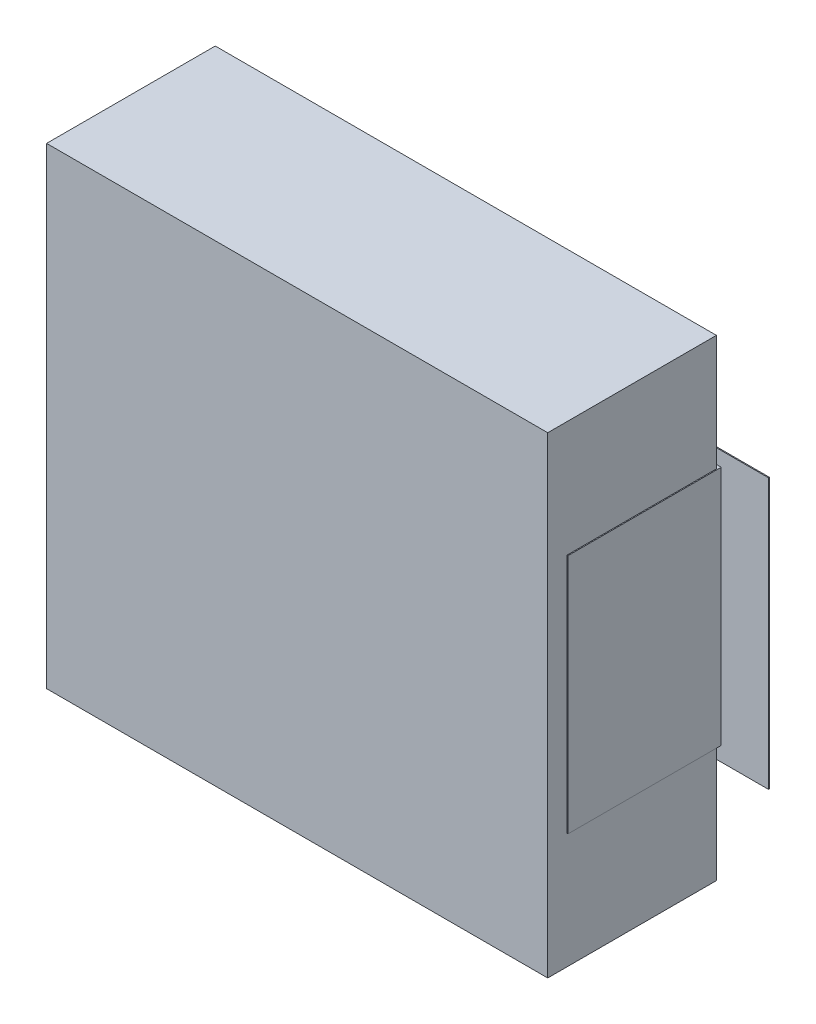
ISO-10303-21;
HEADER;
FILE_DESCRIPTION(('STEP AP214'),'2;1');
FILE_NAME('part.step','',(''),(''),'','','');
FILE_SCHEMA(('AUTOMOTIVE_DESIGN { 1 0 10303 214 1 1 1 1 }'));
ENDSEC;
DATA;
#1=APPLICATION_CONTEXT('core data for automotive mechanical design processes');
#2=APPLICATION_PROTOCOL_DEFINITION('international standard','automotive_design',2000,#1);
#3=PRODUCT_CONTEXT('',#1,'mechanical');
#4=PRODUCT('Part','Part','',(#3));
#5=PRODUCT_RELATED_PRODUCT_CATEGORY('part','',(#4));
#6=PRODUCT_DEFINITION_FORMATION('','',#4);
#7=PRODUCT_DEFINITION_CONTEXT('part definition',#1,'design');
#8=PRODUCT_DEFINITION('design','',#6,#7);
#9=PRODUCT_DEFINITION_SHAPE('','',#8);
#10=(LENGTH_UNIT() NAMED_UNIT(*) SI_UNIT(.MILLI.,.METRE.));
#11=(NAMED_UNIT(*) PLANE_ANGLE_UNIT() SI_UNIT($,.RADIAN.));
#12=(NAMED_UNIT(*) SI_UNIT($,.STERADIAN.) SOLID_ANGLE_UNIT());
#13=UNCERTAINTY_MEASURE_WITH_UNIT(LENGTH_MEASURE(1.E-05),#10,'distance_accuracy_value','');
#14=(GEOMETRIC_REPRESENTATION_CONTEXT(3) GLOBAL_UNCERTAINTY_ASSIGNED_CONTEXT((#13)) GLOBAL_UNIT_ASSIGNED_CONTEXT((#10,
#11,#12)) REPRESENTATION_CONTEXT('',''));
#15=CARTESIAN_POINT('',(0.,0.,0.));
#16=DIRECTION('',(0.,0.,1.));
#17=DIRECTION('',(1.,0.,0.));
#18=AXIS2_PLACEMENT_3D('',#15,#16,#17);
#19=CARTESIAN_POINT('',(0.,0.,0.0762));
#20=DIRECTION('',(0.,0.,1.));
#21=DIRECTION('',(1.,0.,0.));
#22=AXIS2_PLACEMENT_3D('',#19,#20,#21);
#23=PLANE('',#22);
#24=DIRECTION('',(0.,1.,0.));
#25=VECTOR('',#24,1.);
#26=CARTESIAN_POINT('',(1.09999999999992,1.39999999999999,0.0762));
#27=LINE('',#26,#25);
#28=CARTESIAN_POINT('',(1.09999999999992,1.39999999999999,0.0762));
#29=VERTEX_POINT('',#28);
#30=CARTESIAN_POINT('',(1.09999999999992,-1.39999999999999,0.0762));
#31=VERTEX_POINT('',#30);
#32=EDGE_CURVE('E176',#29,#31,#27,.F.);
#33=ORIENTED_EDGE('',*,*,#32,.F.);
#34=DIRECTION('',(1.,0.,0.));
#35=VECTOR('',#34,1.);
#36=CARTESIAN_POINT('',(3.1000000000003,1.39999999999999,0.0762));
#37=LINE('',#36,#35);
#38=CARTESIAN_POINT('',(3.1000000000003,1.39999999999999,0.0762));
#39=VERTEX_POINT('',#38);
#40=EDGE_CURVE('E20',#39,#29,#37,.F.);
#41=ORIENTED_EDGE('',*,*,#40,.F.);
#42=DIRECTION('',(0.,1.,0.));
#43=VECTOR('',#42,1.);
#44=CARTESIAN_POINT('',(3.1000000000003,-1.39999999999999,0.0762));
#45=LINE('',#44,#43);
#46=CARTESIAN_POINT('',(3.1000000000003,-1.39999999999999,0.0762));
#47=VERTEX_POINT('',#46);
#48=EDGE_CURVE('E204',#47,#39,#45,.T.);
#49=ORIENTED_EDGE('',*,*,#48,.F.);
#50=DIRECTION('',(1.,0.,0.));
#51=VECTOR('',#50,1.);
#52=CARTESIAN_POINT('',(1.09999999999992,-1.39999999999999,0.0762));
#53=LINE('',#52,#51);
#54=EDGE_CURVE('E189',#31,#47,#53,.T.);
#55=ORIENTED_EDGE('',*,*,#54,.F.);
#56=EDGE_LOOP('',(#33,#41,#49,#55));
#57=FACE_BOUND('',#56,.T.);
#58=ADVANCED_FACE('F17',(#57),#23,.F.);
#59=CARTESIAN_POINT('',(0.,0.,0.0762));
#60=DIRECTION('',(0.,0.,1.));
#61=DIRECTION('',(1.,0.,0.));
#62=AXIS2_PLACEMENT_3D('',#59,#60,#61);
#63=PLANE('',#62);
#64=DIRECTION('',(0.,1.,0.));
#65=VECTOR('',#64,1.);
#66=CARTESIAN_POINT('',(-1.09999999999992,-1.39999999999999,0.0762));
#67=LINE('',#66,#65);
#68=CARTESIAN_POINT('',(-1.09999999999992,-1.39999999999999,0.0762));
#69=VERTEX_POINT('',#68);
#70=CARTESIAN_POINT('',(-1.09999999999992,1.39999999999999,0.0762));
#71=VERTEX_POINT('',#70);
#72=EDGE_CURVE('E211',#69,#71,#67,.T.);
#73=ORIENTED_EDGE('',*,*,#72,.F.);
#74=DIRECTION('',(1.,0.,0.));
#75=VECTOR('',#74,1.);
#76=CARTESIAN_POINT('',(-3.1000000000003,-1.39999999999999,0.0762));
#77=LINE('',#76,#75);
#78=CARTESIAN_POINT('',(-3.1000000000003,-1.39999999999999,0.0762));
#79=VERTEX_POINT('',#78);
#80=EDGE_CURVE('E206',#79,#69,#77,.T.);
#81=ORIENTED_EDGE('',*,*,#80,.F.);
#82=DIRECTION('',(0.,1.,0.));
#83=VECTOR('',#82,1.);
#84=CARTESIAN_POINT('',(-3.1000000000003,1.39999999999999,0.0762));
#85=LINE('',#84,#83);
#86=CARTESIAN_POINT('',(-3.1000000000003,1.39999999999999,0.0762));
#87=VERTEX_POINT('',#86);
#88=EDGE_CURVE('E224',#87,#79,#85,.F.);
#89=ORIENTED_EDGE('',*,*,#88,.F.);
#90=DIRECTION('',(1.,0.,0.));
#91=VECTOR('',#90,1.);
#92=CARTESIAN_POINT('',(-1.09999999999992,1.39999999999999,0.0762));
#93=LINE('',#92,#91);
#94=EDGE_CURVE('E216',#71,#87,#93,.F.);
#95=ORIENTED_EDGE('',*,*,#94,.F.);
#96=EDGE_LOOP('',(#73,#81,#89,#95));
#97=FACE_BOUND('',#96,.T.);
#98=ADVANCED_FACE('F492',(#97),#63,.F.);
#99=CARTESIAN_POINT('',(3.1000000000003,1.39999999999999,0.0762));
#100=DIRECTION('',(0.,1.,0.));
#101=DIRECTION('',(0.,0.,1.));
#102=AXIS2_PLACEMENT_3D('',#99,#100,#101);
#103=PLANE('',#102);
#104=DIRECTION('',(0.,0.,-1.));
#105=VECTOR('',#104,1.);
#106=CARTESIAN_POINT('',(3.1000000000003,1.39999999999999,0.0762));
#107=LINE('',#106,#105);
#108=CARTESIAN_POINT('',(3.1000000000003,1.39999999999999,0.0862000000000108));
#109=VERTEX_POINT('',#108);
#110=EDGE_CURVE('E185',#39,#109,#107,.F.);
#111=ORIENTED_EDGE('',*,*,#110,.F.);
#112=ORIENTED_EDGE('',*,*,#40,.T.);
#113=DIRECTION('',(0.,0.,1.));
#114=VECTOR('',#113,1.);
#115=CARTESIAN_POINT('',(1.09999999999992,1.39999999999999,0.0762));
#116=LINE('',#115,#114);
#117=CARTESIAN_POINT('',(1.09999999999992,1.39999999999999,0.0862000000000108));
#118=VERTEX_POINT('',#117);
#119=EDGE_CURVE('E182',#118,#29,#116,.F.);
#120=ORIENTED_EDGE('',*,*,#119,.F.);
#121=DIRECTION('',(1.,0.,0.));
#122=VECTOR('',#121,1.);
#123=CARTESIAN_POINT('',(0.,1.39999999999999,0.0862000000000108));
#124=LINE('',#123,#122);
#125=EDGE_CURVE('E227',#109,#118,#124,.F.);
#126=ORIENTED_EDGE('',*,*,#125,.F.);
#127=EDGE_LOOP('',(#111,#112,#120,#126));
#128=FACE_BOUND('',#127,.T.);
#129=ADVANCED_FACE('F181',(#128),#103,.T.);
#130=CARTESIAN_POINT('',(1.09999999999992,1.39999999999999,0.0762));
#131=DIRECTION('',(-1.,0.,0.));
#132=DIRECTION('',(0.,0.,1.));
#133=AXIS2_PLACEMENT_3D('',#130,#131,#132);
#134=PLANE('',#133);
#135=ORIENTED_EDGE('',*,*,#119,.T.);
#136=ORIENTED_EDGE('',*,*,#32,.T.);
#137=DIRECTION('',(0.,0.,-1.));
#138=VECTOR('',#137,1.);
#139=CARTESIAN_POINT('',(1.09999999999992,-1.39999999999999,0.0762));
#140=LINE('',#139,#138);
#141=CARTESIAN_POINT('',(1.09999999999992,-1.39999999999999,0.0862000000000108));
#142=VERTEX_POINT('',#141);
#143=EDGE_CURVE('E191',#142,#31,#140,.T.);
#144=ORIENTED_EDGE('',*,*,#143,.F.);
#145=DIRECTION('',(0.,1.,0.));
#146=VECTOR('',#145,1.);
#147=CARTESIAN_POINT('',(1.09999999999992,0.,0.0862000000000108));
#148=LINE('',#147,#146);
#149=EDGE_CURVE('E195',#118,#142,#148,.F.);
#150=ORIENTED_EDGE('',*,*,#149,.F.);
#151=EDGE_LOOP('',(#135,#136,#144,#150));
#152=FACE_BOUND('',#151,.T.);
#153=ADVANCED_FACE('F193',(#152),#134,.T.);
#154=CARTESIAN_POINT('',(1.09999999999992,-1.39999999999999,0.0762));
#155=DIRECTION('',(0.,-1.,0.));
#156=DIRECTION('',(0.,0.,-1.));
#157=AXIS2_PLACEMENT_3D('',#154,#155,#156);
#158=PLANE('',#157);
#159=ORIENTED_EDGE('',*,*,#143,.T.);
#160=ORIENTED_EDGE('',*,*,#54,.T.);
#161=DIRECTION('',(0.,0.,-1.));
#162=VECTOR('',#161,1.);
#163=CARTESIAN_POINT('',(3.1000000000003,-1.39999999999999,0.0762));
#164=LINE('',#163,#162);
#165=CARTESIAN_POINT('',(3.1000000000003,-1.39999999999999,0.0862000000000108));
#166=VERTEX_POINT('',#165);
#167=EDGE_CURVE('E201',#166,#47,#164,.T.);
#168=ORIENTED_EDGE('',*,*,#167,.F.);
#169=DIRECTION('',(1.,0.,0.));
#170=VECTOR('',#169,1.);
#171=CARTESIAN_POINT('',(0.,-1.39999999999999,0.0862000000000108));
#172=LINE('',#171,#170);
#173=EDGE_CURVE('E230',#142,#166,#172,.T.);
#174=ORIENTED_EDGE('',*,*,#173,.F.);
#175=EDGE_LOOP('',(#159,#160,#168,#174));
#176=FACE_BOUND('',#175,.T.);
#177=ADVANCED_FACE('F502',(#176),#158,.T.);
#178=CARTESIAN_POINT('',(3.1000000000003,-1.39999999999999,0.0762));
#179=DIRECTION('',(1.,0.,0.));
#180=DIRECTION('',(0.,0.,-1.));
#181=AXIS2_PLACEMENT_3D('',#178,#179,#180);
#182=PLANE('',#181);
#183=ORIENTED_EDGE('',*,*,#167,.T.);
#184=ORIENTED_EDGE('',*,*,#48,.T.);
#185=ORIENTED_EDGE('',*,*,#110,.T.);
#186=DIRECTION('',(0.,1.,0.));
#187=VECTOR('',#186,1.);
#188=CARTESIAN_POINT('',(3.1000000000003,0.,0.0862000000000108));
#189=LINE('',#188,#187);
#190=EDGE_CURVE('E233',#166,#109,#189,.T.);
#191=ORIENTED_EDGE('',*,*,#190,.F.);
#192=EDGE_LOOP('',(#183,#184,#185,#191));
#193=FACE_BOUND('',#192,.T.);
#194=ADVANCED_FACE('F505',(#193),#182,.T.);
#195=CARTESIAN_POINT('',(-3.1000000000003,-1.39999999999999,0.0762));
#196=DIRECTION('',(0.,-1.,0.));
#197=DIRECTION('',(0.,0.,-1.));
#198=AXIS2_PLACEMENT_3D('',#195,#196,#197);
#199=PLANE('',#198);
#200=DIRECTION('',(0.,0.,1.));
#201=VECTOR('',#200,1.);
#202=CARTESIAN_POINT('',(-3.1000000000003,-1.39999999999999,0.0762));
#203=LINE('',#202,#201);
#204=CARTESIAN_POINT('',(-3.1000000000003,-1.39999999999999,0.0862000000000108));
#205=VERTEX_POINT('',#204);
#206=EDGE_CURVE('E218',#79,#205,#203,.T.);
#207=ORIENTED_EDGE('',*,*,#206,.F.);
#208=ORIENTED_EDGE('',*,*,#80,.T.);
#209=DIRECTION('',(0.,0.,-1.));
#210=VECTOR('',#209,1.);
#211=CARTESIAN_POINT('',(-1.09999999999992,-1.39999999999999,0.0762));
#212=LINE('',#211,#210);
#213=CARTESIAN_POINT('',(-1.09999999999992,-1.39999999999999,0.0862000000000108));
#214=VERTEX_POINT('',#213);
#215=EDGE_CURVE('E208',#214,#69,#212,.T.);
#216=ORIENTED_EDGE('',*,*,#215,.F.);
#217=DIRECTION('',(1.,0.,0.));
#218=VECTOR('',#217,1.);
#219=CARTESIAN_POINT('',(0.,-1.39999999999999,0.0862000000000108));
#220=LINE('',#219,#218);
#221=EDGE_CURVE('E240',#205,#214,#220,.T.);
#222=ORIENTED_EDGE('',*,*,#221,.F.);
#223=EDGE_LOOP('',(#207,#208,#216,#222));
#224=FACE_BOUND('',#223,.T.);
#225=ADVANCED_FACE('F487',(#224),#199,.T.);
#226=CARTESIAN_POINT('',(-1.09999999999992,-1.39999999999999,0.0762));
#227=DIRECTION('',(1.,0.,0.));
#228=DIRECTION('',(0.,0.,-1.));
#229=AXIS2_PLACEMENT_3D('',#226,#227,#228);
#230=PLANE('',#229);
#231=ORIENTED_EDGE('',*,*,#215,.T.);
#232=ORIENTED_EDGE('',*,*,#72,.T.);
#233=DIRECTION('',(0.,0.,1.));
#234=VECTOR('',#233,1.);
#235=CARTESIAN_POINT('',(-1.09999999999992,1.39999999999999,0.0762));
#236=LINE('',#235,#234);
#237=CARTESIAN_POINT('',(-1.09999999999992,1.39999999999999,0.0862000000000108));
#238=VERTEX_POINT('',#237);
#239=EDGE_CURVE('E213',#238,#71,#236,.F.);
#240=ORIENTED_EDGE('',*,*,#239,.F.);
#241=DIRECTION('',(0.,1.,0.));
#242=VECTOR('',#241,1.);
#243=CARTESIAN_POINT('',(-1.09999999999992,0.,0.0862000000000108));
#244=LINE('',#243,#242);
#245=EDGE_CURVE('E243',#214,#238,#244,.T.);
#246=ORIENTED_EDGE('',*,*,#245,.F.);
#247=EDGE_LOOP('',(#231,#232,#240,#246));
#248=FACE_BOUND('',#247,.T.);
#249=ADVANCED_FACE('F490',(#248),#230,.T.);
#250=CARTESIAN_POINT('',(-1.09999999999992,1.39999999999999,0.0762));
#251=DIRECTION('',(0.,1.,0.));
#252=DIRECTION('',(0.,0.,1.));
#253=AXIS2_PLACEMENT_3D('',#250,#251,#252);
#254=PLANE('',#253);
#255=ORIENTED_EDGE('',*,*,#239,.T.);
#256=ORIENTED_EDGE('',*,*,#94,.T.);
#257=DIRECTION('',(0.,0.,1.));
#258=VECTOR('',#257,1.);
#259=CARTESIAN_POINT('',(-3.1000000000003,1.39999999999999,0.0762));
#260=LINE('',#259,#258);
#261=CARTESIAN_POINT('',(-3.1000000000003,1.39999999999999,0.0862000000000108));
#262=VERTEX_POINT('',#261);
#263=EDGE_CURVE('E221',#262,#87,#260,.F.);
#264=ORIENTED_EDGE('',*,*,#263,.F.);
#265=DIRECTION('',(1.,0.,0.));
#266=VECTOR('',#265,1.);
#267=CARTESIAN_POINT('',(0.,1.39999999999999,0.0862000000000108));
#268=LINE('',#267,#266);
#269=EDGE_CURVE('E246',#238,#262,#268,.F.);
#270=ORIENTED_EDGE('',*,*,#269,.F.);
#271=EDGE_LOOP('',(#255,#256,#264,#270));
#272=FACE_BOUND('',#271,.T.);
#273=ADVANCED_FACE('F480',(#272),#254,.T.);
#274=CARTESIAN_POINT('',(-3.1000000000003,1.39999999999999,0.0762));
#275=DIRECTION('',(-1.,0.,0.));
#276=DIRECTION('',(0.,0.,1.));
#277=AXIS2_PLACEMENT_3D('',#274,#275,#276);
#278=PLANE('',#277);
#279=ORIENTED_EDGE('',*,*,#263,.T.);
#280=ORIENTED_EDGE('',*,*,#88,.T.);
#281=ORIENTED_EDGE('',*,*,#206,.T.);
#282=DIRECTION('',(0.,1.,0.));
#283=VECTOR('',#282,1.);
#284=CARTESIAN_POINT('',(-3.1000000000003,0.,0.0862000000000108));
#285=LINE('',#284,#283);
#286=EDGE_CURVE('E249',#262,#205,#285,.F.);
#287=ORIENTED_EDGE('',*,*,#286,.F.);
#288=EDGE_LOOP('',(#279,#280,#281,#287));
#289=FACE_BOUND('',#288,.T.);
#290=ADVANCED_FACE('F484',(#289),#278,.T.);
#291=CARTESIAN_POINT('',(0.,0.,0.0862000000000108));
#292=DIRECTION('',(0.,0.,1.));
#293=DIRECTION('',(1.,0.,0.));
#294=AXIS2_PLACEMENT_3D('',#291,#292,#293);
#295=PLANE('',#294);
#296=DIRECTION('',(1.,0.,0.));
#297=VECTOR('',#296,1.);
#298=CARTESIAN_POINT('',(0.,-1.25000000000008,0.0862000000000108));
#299=LINE('',#298,#297);
#300=CARTESIAN_POINT('',(2.60999999999972,-1.25000000000008,0.0862000000000108));
#301=VERTEX_POINT('',#300);
#302=CARTESIAN_POINT('',(1.25000000000008,-1.25000000000008,0.0862000000000108));
#303=VERTEX_POINT('',#302);
#304=EDGE_CURVE('E238',#301,#303,#299,.F.);
#305=ORIENTED_EDGE('',*,*,#304,.T.);
#306=DIRECTION('',(0.,1.,0.));
#307=VECTOR('',#306,1.);
#308=CARTESIAN_POINT('',(1.25000000000008,1.25000000000008,0.0862000000000108));
#309=LINE('',#308,#307);
#310=CARTESIAN_POINT('',(1.25000000000008,1.25000000000008,0.0862000000000108));
#311=VERTEX_POINT('',#310);
#312=EDGE_CURVE('E260',#311,#303,#309,.F.);
#313=ORIENTED_EDGE('',*,*,#312,.F.);
#314=DIRECTION('',(1.,0.,0.));
#315=VECTOR('',#314,1.);
#316=CARTESIAN_POINT('',(0.,1.25000000000008,0.0862000000000108));
#317=LINE('',#316,#315);
#318=CARTESIAN_POINT('',(2.60999999999972,1.25000000000008,0.0862000000000108));
#319=VERTEX_POINT('',#318);
#320=EDGE_CURVE('E236',#311,#319,#317,.T.);
#321=ORIENTED_EDGE('',*,*,#320,.T.);
#322=DIRECTION('',(0.,1.,0.));
#323=VECTOR('',#322,1.);
#324=CARTESIAN_POINT('',(2.60999999999972,-1.25000000000008,0.0862000000000108));
#325=LINE('',#324,#323);
#326=EDGE_CURVE('E257',#301,#319,#325,.T.);
#327=ORIENTED_EDGE('',*,*,#326,.F.);
#328=EDGE_LOOP('',(#305,#313,#321,#327));
#329=FACE_BOUND('',#328,.T.);
#330=ORIENTED_EDGE('',*,*,#173,.T.);
#331=ORIENTED_EDGE('',*,*,#190,.T.);
#332=ORIENTED_EDGE('',*,*,#125,.T.);
#333=ORIENTED_EDGE('',*,*,#149,.T.);
#334=EDGE_LOOP('',(#330,#331,#332,#333));
#335=FACE_BOUND('',#334,.T.);
#336=ADVANCED_FACE('F411',(#329,#335),#295,.T.);
#337=CARTESIAN_POINT('',(0.,0.,0.0862000000000108));
#338=DIRECTION('',(0.,0.,1.));
#339=DIRECTION('',(1.,0.,0.));
#340=AXIS2_PLACEMENT_3D('',#337,#338,#339);
#341=PLANE('',#340);
#342=DIRECTION('',(0.,1.,0.));
#343=VECTOR('',#342,1.);
#344=CARTESIAN_POINT('',(-2.60999999999972,1.25000000000008,0.0862000000000108));
#345=LINE('',#344,#343);
#346=CARTESIAN_POINT('',(-2.60999999999972,1.25000000000008,0.0862000000000108));
#347=VERTEX_POINT('',#346);
#348=CARTESIAN_POINT('',(-2.60999999999972,-1.25000000000008,0.0862000000000108));
#349=VERTEX_POINT('',#348);
#350=EDGE_CURVE('E271',#347,#349,#345,.F.);
#351=ORIENTED_EDGE('',*,*,#350,.F.);
#352=DIRECTION('',(1.,0.,0.));
#353=VECTOR('',#352,1.);
#354=CARTESIAN_POINT('',(0.,1.25000000000008,0.0862000000000108));
#355=LINE('',#354,#353);
#356=CARTESIAN_POINT('',(-1.25000000000008,1.25000000000008,0.0862000000000108));
#357=VERTEX_POINT('',#356);
#358=EDGE_CURVE('E254',#347,#357,#355,.T.);
#359=ORIENTED_EDGE('',*,*,#358,.T.);
#360=DIRECTION('',(0.,1.,0.));
#361=VECTOR('',#360,1.);
#362=CARTESIAN_POINT('',(-1.25000000000008,-1.25000000000008,0.0862000000000108));
#363=LINE('',#362,#361);
#364=CARTESIAN_POINT('',(-1.25000000000008,-1.25000000000008,0.0862000000000108));
#365=VERTEX_POINT('',#364);
#366=EDGE_CURVE('E268',#365,#357,#363,.T.);
#367=ORIENTED_EDGE('',*,*,#366,.F.);
#368=DIRECTION('',(1.,0.,0.));
#369=VECTOR('',#368,1.);
#370=CARTESIAN_POINT('',(0.,-1.25000000000008,0.0862000000000108));
#371=LINE('',#370,#369);
#372=EDGE_CURVE('E252',#365,#349,#371,.F.);
#373=ORIENTED_EDGE('',*,*,#372,.T.);
#374=EDGE_LOOP('',(#351,#359,#367,#373));
#375=FACE_BOUND('',#374,.T.);
#376=ORIENTED_EDGE('',*,*,#269,.T.);
#377=ORIENTED_EDGE('',*,*,#286,.T.);
#378=ORIENTED_EDGE('',*,*,#221,.T.);
#379=ORIENTED_EDGE('',*,*,#245,.T.);
#380=EDGE_LOOP('',(#376,#377,#378,#379));
#381=FACE_BOUND('',#380,.T.);
#382=ADVANCED_FACE('F416',(#375,#381),#341,.T.);
#383=CARTESIAN_POINT('',(2.60999999999972,-1.25000000000008,0.0762));
#384=DIRECTION('',(1.,0.,0.));
#385=DIRECTION('',(0.,0.,-1.));
#386=AXIS2_PLACEMENT_3D('',#383,#384,#385);
#387=PLANE('',#386);
#388=DIRECTION('',(0.,0.,-1.));
#389=VECTOR('',#388,1.);
#390=CARTESIAN_POINT('',(2.60999999999972,-1.25000000000008,0.0762));
#391=LINE('',#390,#389);
#392=CARTESIAN_POINT('',(2.60999999999972,-1.25000000000008,1.67619999999995));
#393=VERTEX_POINT('',#392);
#394=EDGE_CURVE('E280',#301,#393,#391,.F.);
#395=ORIENTED_EDGE('',*,*,#394,.F.);
#396=ORIENTED_EDGE('',*,*,#326,.T.);
#397=DIRECTION('',(0.,0.,1.));
#398=VECTOR('',#397,1.);
#399=CARTESIAN_POINT('',(2.60999999999972,1.25000000000008,0.0762));
#400=LINE('',#399,#398);
#401=CARTESIAN_POINT('',(2.60999999999972,1.25000000000008,1.67619999999995));
#402=VERTEX_POINT('',#401);
#403=EDGE_CURVE('E277',#402,#319,#400,.F.);
#404=ORIENTED_EDGE('',*,*,#403,.F.);
#405=DIRECTION('',(0.,1.,0.));
#406=VECTOR('',#405,1.);
#407=CARTESIAN_POINT('',(2.60999999999972,0.,1.67619999999995));
#408=LINE('',#407,#406);
#409=EDGE_CURVE('E288',#393,#402,#408,.T.);
#410=ORIENTED_EDGE('',*,*,#409,.F.);
#411=EDGE_LOOP('',(#395,#396,#404,#410));
#412=FACE_BOUND('',#411,.T.);
#413=ADVANCED_FACE('F414',(#412),#387,.T.);
#414=CARTESIAN_POINT('',(1.25000000000008,1.25000000000008,0.0762));
#415=DIRECTION('',(-1.,0.,0.));
#416=DIRECTION('',(0.,0.,1.));
#417=AXIS2_PLACEMENT_3D('',#414,#415,#416);
#418=PLANE('',#417);
#419=DIRECTION('',(0.,0.,1.));
#420=VECTOR('',#419,1.);
#421=CARTESIAN_POINT('',(1.25000000000008,1.25000000000008,0.0762));
#422=LINE('',#421,#420);
#423=CARTESIAN_POINT('',(1.25000000000008,1.25000000000008,0.126200000000003));
#424=VERTEX_POINT('',#423);
#425=EDGE_CURVE('E274',#311,#424,#422,.T.);
#426=ORIENTED_EDGE('',*,*,#425,.F.);
#427=ORIENTED_EDGE('',*,*,#312,.T.);
#428=DIRECTION('',(0.,0.,-1.));
#429=VECTOR('',#428,1.);
#430=CARTESIAN_POINT('',(1.25000000000008,-1.25000000000008,0.0762));
#431=LINE('',#430,#429);
#432=CARTESIAN_POINT('',(1.25000000000008,-1.25000000000008,0.126200000000003));
#433=VERTEX_POINT('',#432);
#434=EDGE_CURVE('E282',#433,#303,#431,.T.);
#435=ORIENTED_EDGE('',*,*,#434,.F.);
#436=DIRECTION('',(0.,1.,0.));
#437=VECTOR('',#436,1.);
#438=CARTESIAN_POINT('',(1.25000000000008,0.,0.126200000000003));
#439=LINE('',#438,#437);
#440=EDGE_CURVE('E294',#433,#424,#439,.T.);
#441=ORIENTED_EDGE('',*,*,#440,.T.);
#442=EDGE_LOOP('',(#426,#427,#435,#441));
#443=FACE_BOUND('',#442,.T.);
#444=ADVANCED_FACE('F408',(#443),#418,.T.);
#445=CARTESIAN_POINT('',(-1.25000000000008,-1.25000000000008,0.0762));
#446=DIRECTION('',(1.,0.,0.));
#447=DIRECTION('',(0.,0.,-1.));
#448=AXIS2_PLACEMENT_3D('',#445,#446,#447);
#449=PLANE('',#448);
#450=DIRECTION('',(0.,0.,-1.));
#451=VECTOR('',#450,1.);
#452=CARTESIAN_POINT('',(-1.25000000000008,-1.25000000000008,0.0762));
#453=LINE('',#452,#451);
#454=CARTESIAN_POINT('',(-1.25000000000008,-1.25000000000008,0.126200000000003));
#455=VERTEX_POINT('',#454);
#456=EDGE_CURVE('E265',#455,#365,#453,.T.);
#457=ORIENTED_EDGE('',*,*,#456,.T.);
#458=ORIENTED_EDGE('',*,*,#366,.T.);
#459=DIRECTION('',(0.,0.,-1.));
#460=VECTOR('',#459,1.);
#461=CARTESIAN_POINT('',(-1.25000000000008,1.25000000000008,0.0762));
#462=LINE('',#461,#460);
#463=CARTESIAN_POINT('',(-1.25000000000008,1.25000000000008,0.126200000000003));
#464=VERTEX_POINT('',#463);
#465=EDGE_CURVE('E263',#357,#464,#462,.F.);
#466=ORIENTED_EDGE('',*,*,#465,.T.);
#467=DIRECTION('',(0.,1.,0.));
#468=VECTOR('',#467,1.);
#469=CARTESIAN_POINT('',(-1.25000000000008,0.,0.126200000000003));
#470=LINE('',#469,#468);
#471=EDGE_CURVE('E300',#464,#455,#470,.F.);
#472=ORIENTED_EDGE('',*,*,#471,.T.);
#473=EDGE_LOOP('',(#457,#458,#466,#472));
#474=FACE_BOUND('',#473,.T.);
#475=ADVANCED_FACE('F423',(#474),#449,.T.);
#476=CARTESIAN_POINT('',(-2.60999999999972,1.25000000000008,0.0762));
#477=DIRECTION('',(-1.,0.,0.));
#478=DIRECTION('',(0.,0.,1.));
#479=AXIS2_PLACEMENT_3D('',#476,#477,#478);
#480=PLANE('',#479);
#481=DIRECTION('',(0.,0.,1.));
#482=VECTOR('',#481,1.);
#483=CARTESIAN_POINT('',(-2.60999999999972,1.25000000000008,0.0762));
#484=LINE('',#483,#482);
#485=CARTESIAN_POINT('',(-2.60999999999972,1.25000000000008,1.67619999999995));
#486=VERTEX_POINT('',#485);
#487=EDGE_CURVE('E314',#347,#486,#484,.T.);
#488=ORIENTED_EDGE('',*,*,#487,.F.);
#489=ORIENTED_EDGE('',*,*,#350,.T.);
#490=DIRECTION('',(0.,0.,-1.));
#491=VECTOR('',#490,1.);
#492=CARTESIAN_POINT('',(-2.60999999999972,-1.25000000000008,0.0762));
#493=LINE('',#492,#491);
#494=CARTESIAN_POINT('',(-2.60999999999972,-1.25000000000008,1.67619999999995));
#495=VERTEX_POINT('',#494);
#496=EDGE_CURVE('E311',#495,#349,#493,.T.);
#497=ORIENTED_EDGE('',*,*,#496,.F.);
#498=DIRECTION('',(0.,1.,0.));
#499=VECTOR('',#498,1.);
#500=CARTESIAN_POINT('',(-2.60999999999972,0.,1.67619999999995));
#501=LINE('',#500,#499);
#502=EDGE_CURVE('E322',#486,#495,#501,.F.);
#503=ORIENTED_EDGE('',*,*,#502,.F.);
#504=EDGE_LOOP('',(#488,#489,#497,#503));
#505=FACE_BOUND('',#504,.T.);
#506=ADVANCED_FACE('F460',(#505),#480,.T.);
#507=CARTESIAN_POINT('',(2.60999999999972,1.25000000000008,0.0762));
#508=DIRECTION('',(0.,1.,0.));
#509=DIRECTION('',(0.,0.,1.));
#510=AXIS2_PLACEMENT_3D('',#507,#508,#509);
#511=PLANE('',#510);
#512=ORIENTED_EDGE('',*,*,#403,.T.);
#513=ORIENTED_EDGE('',*,*,#320,.F.);
#514=ORIENTED_EDGE('',*,*,#425,.T.);
#515=DIRECTION('',(1.,0.,0.));
#516=VECTOR('',#515,1.);
#517=CARTESIAN_POINT('',(0.,1.25000000000008,0.126200000000003));
#518=LINE('',#517,#516);
#519=CARTESIAN_POINT('',(2.59999999999976,1.25000000000008,0.126200000000003));
#520=VERTEX_POINT('',#519);
#521=EDGE_CURVE('E296',#424,#520,#518,.T.);
#522=ORIENTED_EDGE('',*,*,#521,.T.);
#523=DIRECTION('',(0.,0.,-1.));
#524=VECTOR('',#523,1.);
#525=CARTESIAN_POINT('',(2.59999999999976,1.25000000000008,0.0762));
#526=LINE('',#525,#524);
#527=CARTESIAN_POINT('',(2.59999999999976,1.25000000000008,1.67619999999995));
#528=VERTEX_POINT('',#527);
#529=EDGE_CURVE('E330',#528,#520,#526,.T.);
#530=ORIENTED_EDGE('',*,*,#529,.F.);
#531=DIRECTION('',(1.,0.,0.));
#532=VECTOR('',#531,1.);
#533=CARTESIAN_POINT('',(0.,1.25000000000008,1.67619999999995));
#534=LINE('',#533,#532);
#535=EDGE_CURVE('E291',#402,#528,#534,.F.);
#536=ORIENTED_EDGE('',*,*,#535,.F.);
#537=EDGE_LOOP('',(#512,#513,#514,#522,#530,#536));
#538=FACE_BOUND('',#537,.T.);
#539=ADVANCED_FACE('F404',(#538),#511,.T.);
#540=CARTESIAN_POINT('',(1.25000000000008,-1.25000000000008,0.0762));
#541=DIRECTION('',(0.,-1.,0.));
#542=DIRECTION('',(0.,0.,-1.));
#543=AXIS2_PLACEMENT_3D('',#540,#541,#542);
#544=PLANE('',#543);
#545=ORIENTED_EDGE('',*,*,#434,.T.);
#546=ORIENTED_EDGE('',*,*,#304,.F.);
#547=ORIENTED_EDGE('',*,*,#394,.T.);
#548=DIRECTION('',(1.,0.,0.));
#549=VECTOR('',#548,1.);
#550=CARTESIAN_POINT('',(0.,-1.25000000000008,1.67619999999995));
#551=LINE('',#550,#549);
#552=CARTESIAN_POINT('',(2.59999999999976,-1.25000000000008,1.67619999999995));
#553=VERTEX_POINT('',#552);
#554=EDGE_CURVE('E285',#553,#393,#551,.T.);
#555=ORIENTED_EDGE('',*,*,#554,.F.);
#556=DIRECTION('',(0.,0.,-1.));
#557=VECTOR('',#556,1.);
#558=CARTESIAN_POINT('',(2.59999999999976,-1.25000000000008,0.0762));
#559=LINE('',#558,#557);
#560=CARTESIAN_POINT('',(2.59999999999976,-1.25000000000008,0.126200000000003));
#561=VERTEX_POINT('',#560);
#562=EDGE_CURVE('E341',#561,#553,#559,.F.);
#563=ORIENTED_EDGE('',*,*,#562,.F.);
#564=DIRECTION('',(1.,0.,0.));
#565=VECTOR('',#564,1.);
#566=CARTESIAN_POINT('',(0.,-1.25000000000008,0.126200000000003));
#567=LINE('',#566,#565);
#568=EDGE_CURVE('E305',#561,#433,#567,.F.);
#569=ORIENTED_EDGE('',*,*,#568,.T.);
#570=EDGE_LOOP('',(#545,#546,#547,#555,#563,#569));
#571=FACE_BOUND('',#570,.T.);
#572=ADVANCED_FACE('F396',(#571),#544,.T.);
#573=CARTESIAN_POINT('',(0.,0.,1.67619999999995));
#574=DIRECTION('',(0.,0.,1.));
#575=DIRECTION('',(1.,0.,0.));
#576=AXIS2_PLACEMENT_3D('',#573,#574,#575);
#577=PLANE('',#576);
#578=ORIENTED_EDGE('',*,*,#535,.T.);
#579=DIRECTION('',(0.,1.,0.));
#580=VECTOR('',#579,1.);
#581=CARTESIAN_POINT('',(2.59999999999976,-2.45000000000011,1.67619999999995));
#582=LINE('',#581,#580);
#583=EDGE_CURVE('E344',#553,#528,#582,.T.);
#584=ORIENTED_EDGE('',*,*,#583,.F.);
#585=ORIENTED_EDGE('',*,*,#554,.T.);
#586=ORIENTED_EDGE('',*,*,#409,.T.);
#587=EDGE_LOOP('',(#578,#584,#585,#586));
#588=FACE_BOUND('',#587,.T.);
#589=ADVANCED_FACE('F401',(#588),#577,.T.);
#590=CARTESIAN_POINT('',(0.,0.,0.126200000000003));
#591=DIRECTION('',(0.,0.,1.));
#592=DIRECTION('',(1.,0.,0.));
#593=AXIS2_PLACEMENT_3D('',#590,#591,#592);
#594=PLANE('',#593);
#595=DIRECTION('',(0.,1.,0.));
#596=VECTOR('',#595,1.);
#597=CARTESIAN_POINT('',(2.59999999999976,-2.45000000000011,0.126200000000003));
#598=LINE('',#597,#596);
#599=CARTESIAN_POINT('',(2.59999999999976,-2.45000000000011,0.126200000000003));
#600=VERTEX_POINT('',#599);
#601=EDGE_CURVE('E338',#600,#561,#598,.T.);
#602=ORIENTED_EDGE('',*,*,#601,.F.);
#603=DIRECTION('',(1.,0.,0.));
#604=VECTOR('',#603,1.);
#605=CARTESIAN_POINT('',(-2.59999999999976,-2.45000000000011,0.126200000000003));
#606=LINE('',#605,#604);
#607=CARTESIAN_POINT('',(-2.59999999999976,-2.45000000000011,0.126200000000003));
#608=VERTEX_POINT('',#607);
#609=EDGE_CURVE('E328',#608,#600,#606,.T.);
#610=ORIENTED_EDGE('',*,*,#609,.F.);
#611=DIRECTION('',(0.,1.,0.));
#612=VECTOR('',#611,1.);
#613=CARTESIAN_POINT('',(-2.59999999999976,0.,0.126200000000003));
#614=LINE('',#613,#612);
#615=CARTESIAN_POINT('',(-2.59999999999976,-1.25000000000008,0.126200000000003));
#616=VERTEX_POINT('',#615);
#617=EDGE_CURVE('E303',#616,#608,#614,.F.);
#618=ORIENTED_EDGE('',*,*,#617,.F.);
#619=DIRECTION('',(1.,0.,0.));
#620=VECTOR('',#619,1.);
#621=CARTESIAN_POINT('',(-2.60999999999972,-1.25000000000008,0.126200000000003));
#622=LINE('',#621,#620);
#623=EDGE_CURVE('E308',#455,#616,#622,.F.);
#624=ORIENTED_EDGE('',*,*,#623,.F.);
#625=ORIENTED_EDGE('',*,*,#471,.F.);
#626=DIRECTION('',(1.,0.,0.));
#627=VECTOR('',#626,1.);
#628=CARTESIAN_POINT('',(-1.25000000000008,1.25000000000008,0.126200000000003));
#629=LINE('',#628,#627);
#630=CARTESIAN_POINT('',(-2.59999999999976,1.25000000000008,0.126200000000003));
#631=VERTEX_POINT('',#630);
#632=EDGE_CURVE('E316',#631,#464,#629,.T.);
#633=ORIENTED_EDGE('',*,*,#632,.F.);
#634=DIRECTION('',(0.,1.,0.));
#635=VECTOR('',#634,1.);
#636=CARTESIAN_POINT('',(-2.59999999999976,0.,0.126200000000003));
#637=LINE('',#636,#635);
#638=CARTESIAN_POINT('',(-2.59999999999976,2.45000000000011,0.126200000000003));
#639=VERTEX_POINT('',#638);
#640=EDGE_CURVE('E298',#639,#631,#637,.F.);
#641=ORIENTED_EDGE('',*,*,#640,.F.);
#642=DIRECTION('',(1.,0.,0.));
#643=VECTOR('',#642,1.);
#644=CARTESIAN_POINT('',(2.59999999999976,2.45000000000011,0.126200000000003));
#645=LINE('',#644,#643);
#646=CARTESIAN_POINT('',(2.59999999999976,2.45000000000011,0.126200000000003));
#647=VERTEX_POINT('',#646);
#648=EDGE_CURVE('E350',#647,#639,#645,.F.);
#649=ORIENTED_EDGE('',*,*,#648,.F.);
#650=DIRECTION('',(0.,1.,0.));
#651=VECTOR('',#650,1.);
#652=CARTESIAN_POINT('',(2.59999999999976,-2.45000000000011,0.126200000000003));
#653=LINE('',#652,#651);
#654=EDGE_CURVE('E333',#520,#647,#653,.T.);
#655=ORIENTED_EDGE('',*,*,#654,.F.);
#656=ORIENTED_EDGE('',*,*,#521,.F.);
#657=ORIENTED_EDGE('',*,*,#440,.F.);
#658=ORIENTED_EDGE('',*,*,#568,.F.);
#659=EDGE_LOOP('',(#602,#610,#618,#624,#625,#633,#641,#649,#655,#656,#657,#658));
#660=FACE_BOUND('',#659,.T.);
#661=ADVANCED_FACE('F383',(#660),#594,.F.);
#662=CARTESIAN_POINT('',(-2.60999999999972,-1.25000000000008,0.0762));
#663=DIRECTION('',(0.,-1.,0.));
#664=DIRECTION('',(0.,0.,-1.));
#665=AXIS2_PLACEMENT_3D('',#662,#663,#664);
#666=PLANE('',#665);
#667=ORIENTED_EDGE('',*,*,#496,.T.);
#668=ORIENTED_EDGE('',*,*,#372,.F.);
#669=ORIENTED_EDGE('',*,*,#456,.F.);
#670=ORIENTED_EDGE('',*,*,#623,.T.);
#671=DIRECTION('',(0.,0.,1.));
#672=VECTOR('',#671,1.);
#673=CARTESIAN_POINT('',(-2.59999999999976,-1.25000000000008,0.0762));
#674=LINE('',#673,#672);
#675=CARTESIAN_POINT('',(-2.59999999999976,-1.25000000000008,1.67619999999995));
#676=VERTEX_POINT('',#675);
#677=EDGE_CURVE('E352',#676,#616,#674,.F.);
#678=ORIENTED_EDGE('',*,*,#677,.F.);
#679=DIRECTION('',(1.,0.,0.));
#680=VECTOR('',#679,1.);
#681=CARTESIAN_POINT('',(0.,-1.25000000000008,1.67619999999995));
#682=LINE('',#681,#680);
#683=EDGE_CURVE('E325',#495,#676,#682,.T.);
#684=ORIENTED_EDGE('',*,*,#683,.F.);
#685=EDGE_LOOP('',(#667,#668,#669,#670,#678,#684));
#686=FACE_BOUND('',#685,.T.);
#687=ADVANCED_FACE('F447',(#686),#666,.T.);
#688=CARTESIAN_POINT('',(-1.25000000000008,1.25000000000008,0.0762));
#689=DIRECTION('',(0.,1.,0.));
#690=DIRECTION('',(0.,0.,1.));
#691=AXIS2_PLACEMENT_3D('',#688,#689,#690);
#692=PLANE('',#691);
#693=ORIENTED_EDGE('',*,*,#465,.F.);
#694=ORIENTED_EDGE('',*,*,#358,.F.);
#695=ORIENTED_EDGE('',*,*,#487,.T.);
#696=DIRECTION('',(1.,0.,0.));
#697=VECTOR('',#696,1.);
#698=CARTESIAN_POINT('',(0.,1.25000000000008,1.67619999999995));
#699=LINE('',#698,#697);
#700=CARTESIAN_POINT('',(-2.59999999999976,1.25000000000008,1.67619999999995));
#701=VERTEX_POINT('',#700);
#702=EDGE_CURVE('E319',#701,#486,#699,.F.);
#703=ORIENTED_EDGE('',*,*,#702,.F.);
#704=DIRECTION('',(0.,0.,1.));
#705=VECTOR('',#704,1.);
#706=CARTESIAN_POINT('',(-2.59999999999976,1.25000000000008,0.0762));
#707=LINE('',#706,#705);
#708=EDGE_CURVE('E359',#631,#701,#707,.T.);
#709=ORIENTED_EDGE('',*,*,#708,.F.);
#710=ORIENTED_EDGE('',*,*,#632,.T.);
#711=EDGE_LOOP('',(#693,#694,#695,#703,#709,#710));
#712=FACE_BOUND('',#711,.T.);
#713=ADVANCED_FACE('F443',(#712),#692,.T.);
#714=CARTESIAN_POINT('',(0.,0.,1.67619999999995));
#715=DIRECTION('',(0.,0.,1.));
#716=DIRECTION('',(1.,0.,0.));
#717=AXIS2_PLACEMENT_3D('',#714,#715,#716);
#718=PLANE('',#717);
#719=ORIENTED_EDGE('',*,*,#683,.T.);
#720=DIRECTION('',(0.,1.,0.));
#721=VECTOR('',#720,1.);
#722=CARTESIAN_POINT('',(-2.59999999999976,2.45000000000011,1.67619999999995));
#723=LINE('',#722,#721);
#724=EDGE_CURVE('E362',#701,#676,#723,.F.);
#725=ORIENTED_EDGE('',*,*,#724,.F.);
#726=ORIENTED_EDGE('',*,*,#702,.T.);
#727=ORIENTED_EDGE('',*,*,#502,.T.);
#728=EDGE_LOOP('',(#719,#725,#726,#727));
#729=FACE_BOUND('',#728,.T.);
#730=ADVANCED_FACE('F440',(#729),#718,.T.);
#731=CARTESIAN_POINT('',(-2.59999999999976,-2.45000000000011,0.0762));
#732=DIRECTION('',(0.,-1.,0.));
#733=DIRECTION('',(0.,0.,-1.));
#734=AXIS2_PLACEMENT_3D('',#731,#732,#733);
#735=PLANE('',#734);
#736=DIRECTION('',(0.,0.,1.));
#737=VECTOR('',#736,1.);
#738=CARTESIAN_POINT('',(-2.59999999999976,-2.45000000000011,0.0762));
#739=LINE('',#738,#737);
#740=CARTESIAN_POINT('',(-2.59999999999976,-2.45000000000011,1.876298));
#741=VERTEX_POINT('',#740);
#742=EDGE_CURVE('E355',#608,#741,#739,.T.);
#743=ORIENTED_EDGE('',*,*,#742,.F.);
#744=ORIENTED_EDGE('',*,*,#609,.T.);
#745=DIRECTION('',(0.,0.,-1.));
#746=VECTOR('',#745,1.);
#747=CARTESIAN_POINT('',(2.59999999999976,-2.45000000000011,0.0762));
#748=LINE('',#747,#746);
#749=CARTESIAN_POINT('',(2.59999999999976,-2.45000000000011,1.876298));
#750=VERTEX_POINT('',#749);
#751=EDGE_CURVE('E335',#750,#600,#748,.T.);
#752=ORIENTED_EDGE('',*,*,#751,.F.);
#753=DIRECTION('',(1.,0.,0.));
#754=VECTOR('',#753,1.);
#755=CARTESIAN_POINT('',(0.,-2.45000000000011,1.876298));
#756=LINE('',#755,#754);
#757=EDGE_CURVE('E365',#741,#750,#756,.T.);
#758=ORIENTED_EDGE('',*,*,#757,.F.);
#759=EDGE_LOOP('',(#743,#744,#752,#758));
#760=FACE_BOUND('',#759,.T.);
#761=ADVANCED_FACE('F392',(#760),#735,.T.);
#762=CARTESIAN_POINT('',(2.59999999999976,-2.45000000000011,0.0762));
#763=DIRECTION('',(1.,0.,0.));
#764=DIRECTION('',(0.,0.,-1.));
#765=AXIS2_PLACEMENT_3D('',#762,#763,#764);
#766=PLANE('',#765);
#767=ORIENTED_EDGE('',*,*,#562,.T.);
#768=ORIENTED_EDGE('',*,*,#583,.T.);
#769=ORIENTED_EDGE('',*,*,#529,.T.);
#770=ORIENTED_EDGE('',*,*,#654,.T.);
#771=DIRECTION('',(0.,0.,1.));
#772=VECTOR('',#771,1.);
#773=CARTESIAN_POINT('',(2.59999999999976,2.45000000000011,0.0762));
#774=LINE('',#773,#772);
#775=CARTESIAN_POINT('',(2.59999999999976,2.45000000000011,1.876298));
#776=VERTEX_POINT('',#775);
#777=EDGE_CURVE('E347',#776,#647,#774,.F.);
#778=ORIENTED_EDGE('',*,*,#777,.F.);
#779=DIRECTION('',(0.,1.,0.));
#780=VECTOR('',#779,1.);
#781=CARTESIAN_POINT('',(2.59999999999976,0.,1.876298));
#782=LINE('',#781,#780);
#783=EDGE_CURVE('E368',#750,#776,#782,.T.);
#784=ORIENTED_EDGE('',*,*,#783,.F.);
#785=ORIENTED_EDGE('',*,*,#751,.T.);
#786=ORIENTED_EDGE('',*,*,#601,.T.);
#787=EDGE_LOOP('',(#767,#768,#769,#770,#778,#784,#785,#786));
#788=FACE_BOUND('',#787,.T.);
#789=ADVANCED_FACE('F378',(#788),#766,.T.);
#790=CARTESIAN_POINT('',(2.59999999999976,2.45000000000011,0.0762));
#791=DIRECTION('',(0.,1.,0.));
#792=DIRECTION('',(0.,0.,1.));
#793=AXIS2_PLACEMENT_3D('',#790,#791,#792);
#794=PLANE('',#793);
#795=ORIENTED_EDGE('',*,*,#777,.T.);
#796=ORIENTED_EDGE('',*,*,#648,.T.);
#797=DIRECTION('',(0.,0.,1.));
#798=VECTOR('',#797,1.);
#799=CARTESIAN_POINT('',(-2.59999999999976,2.45000000000011,0.0762));
#800=LINE('',#799,#798);
#801=CARTESIAN_POINT('',(-2.59999999999976,2.45000000000011,1.876298));
#802=VERTEX_POINT('',#801);
#803=EDGE_CURVE('E35',#802,#639,#800,.F.);
#804=ORIENTED_EDGE('',*,*,#803,.F.);
#805=DIRECTION('',(1.,0.,0.));
#806=VECTOR('',#805,1.);
#807=CARTESIAN_POINT('',(0.,2.45000000000011,1.876298));
#808=LINE('',#807,#806);
#809=EDGE_CURVE('E26',#776,#802,#808,.F.);
#810=ORIENTED_EDGE('',*,*,#809,.F.);
#811=EDGE_LOOP('',(#795,#796,#804,#810));
#812=FACE_BOUND('',#811,.T.);
#813=ADVANCED_FACE('F375',(#812),#794,.T.);
#814=CARTESIAN_POINT('',(-2.59999999999976,2.45000000000011,0.0762));
#815=DIRECTION('',(-1.,0.,0.));
#816=DIRECTION('',(0.,0.,1.));
#817=AXIS2_PLACEMENT_3D('',#814,#815,#816);
#818=PLANE('',#817);
#819=ORIENTED_EDGE('',*,*,#708,.T.);
#820=ORIENTED_EDGE('',*,*,#724,.T.);
#821=ORIENTED_EDGE('',*,*,#677,.T.);
#822=ORIENTED_EDGE('',*,*,#617,.T.);
#823=ORIENTED_EDGE('',*,*,#742,.T.);
#824=DIRECTION('',(0.,1.,0.));
#825=VECTOR('',#824,1.);
#826=CARTESIAN_POINT('',(-2.59999999999976,0.,1.876298));
#827=LINE('',#826,#825);
#828=EDGE_CURVE('E11',#802,#741,#827,.F.);
#829=ORIENTED_EDGE('',*,*,#828,.F.);
#830=ORIENTED_EDGE('',*,*,#803,.T.);
#831=ORIENTED_EDGE('',*,*,#640,.T.);
#832=EDGE_LOOP('',(#819,#820,#821,#822,#823,#829,#830,#831));
#833=FACE_BOUND('',#832,.T.);
#834=ADVANCED_FACE('F388',(#833),#818,.T.);
#835=CARTESIAN_POINT('',(0.,0.,1.876298));
#836=DIRECTION('',(0.,0.,1.));
#837=DIRECTION('',(1.,0.,0.));
#838=AXIS2_PLACEMENT_3D('',#835,#836,#837);
#839=PLANE('',#838);
#840=ORIENTED_EDGE('',*,*,#809,.T.);
#841=ORIENTED_EDGE('',*,*,#828,.T.);
#842=ORIENTED_EDGE('',*,*,#757,.T.);
#843=ORIENTED_EDGE('',*,*,#783,.T.);
#844=EDGE_LOOP('',(#840,#841,#842,#843));
#845=FACE_BOUND('',#844,.T.);
#846=ADVANCED_FACE('F373',(#845),#839,.T.);
#847=CLOSED_SHELL('',(#58,#98,#129,#153,#177,#194,#225,#249,#273,#290,#336,#382,#413,#444,#475,
#506,#539,#572,#589,#661,#687,#713,#730,#761,#789,#813,#834,#846));
#848=MANIFOLD_SOLID_BREP('B1',#847);
#849=ADVANCED_BREP_SHAPE_REPRESENTATION('',(#18,#848),#14);
#850=SHAPE_DEFINITION_REPRESENTATION(#9,#849);
ENDSEC;
END-ISO-10303-21;
